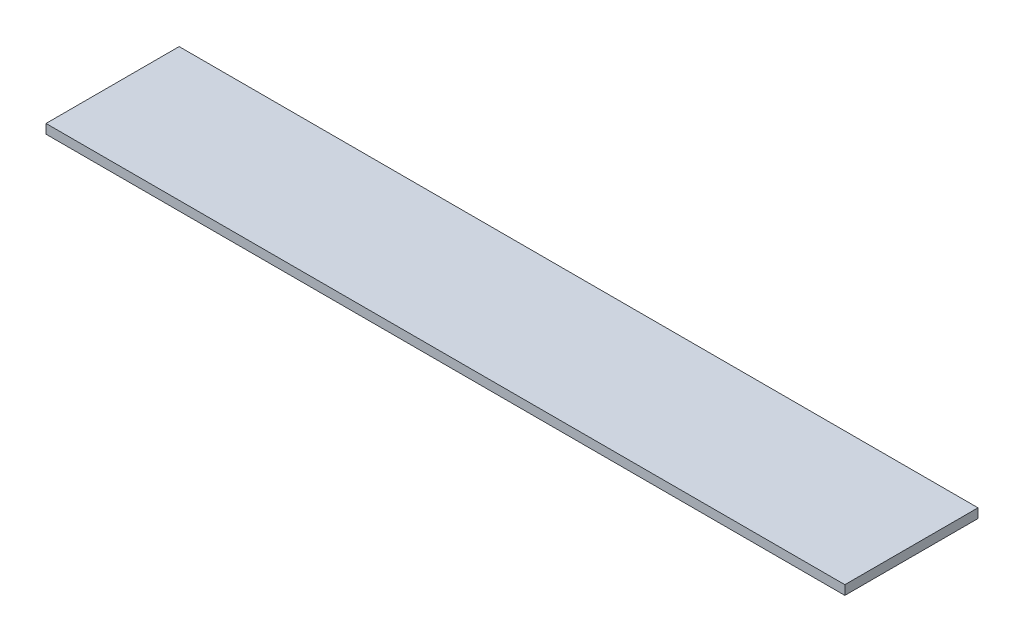
ISO-10303-21;
HEADER;
FILE_DESCRIPTION(('STEP AP214'),'2;1');
FILE_NAME('part.step','',(''),(''),'','','');
FILE_SCHEMA(('AUTOMOTIVE_DESIGN { 1 0 10303 214 1 1 1 1 }'));
ENDSEC;
DATA;
#1=APPLICATION_CONTEXT('core data for automotive mechanical design processes');
#2=APPLICATION_PROTOCOL_DEFINITION('international standard','automotive_design',2000,#1);
#3=PRODUCT_CONTEXT('',#1,'mechanical');
#4=PRODUCT('Part','Part','',(#3));
#5=PRODUCT_RELATED_PRODUCT_CATEGORY('part','',(#4));
#6=PRODUCT_DEFINITION_FORMATION('','',#4);
#7=PRODUCT_DEFINITION_CONTEXT('part definition',#1,'design');
#8=PRODUCT_DEFINITION('design','',#6,#7);
#9=PRODUCT_DEFINITION_SHAPE('','',#8);
#10=(LENGTH_UNIT() NAMED_UNIT(*) SI_UNIT(.MILLI.,.METRE.));
#11=(NAMED_UNIT(*) PLANE_ANGLE_UNIT() SI_UNIT($,.RADIAN.));
#12=(NAMED_UNIT(*) SI_UNIT($,.STERADIAN.) SOLID_ANGLE_UNIT());
#13=UNCERTAINTY_MEASURE_WITH_UNIT(LENGTH_MEASURE(1.E-05),#10,'distance_accuracy_value','');
#14=(GEOMETRIC_REPRESENTATION_CONTEXT(3) GLOBAL_UNCERTAINTY_ASSIGNED_CONTEXT((#13)) GLOBAL_UNIT_ASSIGNED_CONTEXT((#10,
#11,#12)) REPRESENTATION_CONTEXT('',''));
#15=CARTESIAN_POINT('',(0.,0.,0.));
#16=DIRECTION('',(0.,0.,1.));
#17=DIRECTION('',(1.,0.,0.));
#18=AXIS2_PLACEMENT_3D('',#15,#16,#17);
#19=CARTESIAN_POINT('',(30.,0.7,5.));
#20=DIRECTION('',(-1.,0.,0.));
#21=DIRECTION('',(0.,0.,1.));
#22=AXIS2_PLACEMENT_3D('',#19,#20,#21);
#23=PLANE('',#22);
#24=DIRECTION('',(0.,0.,-1.));
#25=VECTOR('',#24,1.);
#26=CARTESIAN_POINT('',(30.,0.,5.));
#27=LINE('',#26,#25);
#28=CARTESIAN_POINT('',(30.,0.,5.));
#29=VERTEX_POINT('',#28);
#30=CARTESIAN_POINT('',(30.,0.,-5.));
#31=VERTEX_POINT('',#30);
#32=EDGE_CURVE('E96',#29,#31,#27,.T.);
#33=ORIENTED_EDGE('',*,*,#32,.T.);
#34=DIRECTION('',(0.,-1.,0.));
#35=VECTOR('',#34,1.);
#36=CARTESIAN_POINT('',(30.,0.7,-5.));
#37=LINE('',#36,#35);
#38=CARTESIAN_POINT('',(30.,0.7,-5.));
#39=VERTEX_POINT('',#38);
#40=EDGE_CURVE('E11',#39,#31,#37,.T.);
#41=ORIENTED_EDGE('',*,*,#40,.F.);
#42=DIRECTION('',(0.,0.,-1.));
#43=VECTOR('',#42,1.);
#44=CARTESIAN_POINT('',(30.,0.7,5.));
#45=LINE('',#44,#43);
#46=CARTESIAN_POINT('',(30.,0.7,5.));
#47=VERTEX_POINT('',#46);
#48=EDGE_CURVE('E84',#47,#39,#45,.T.);
#49=ORIENTED_EDGE('',*,*,#48,.F.);
#50=DIRECTION('',(0.,-1.,0.));
#51=VECTOR('',#50,1.);
#52=CARTESIAN_POINT('',(30.,0.7,5.));
#53=LINE('',#52,#51);
#54=EDGE_CURVE('E92',#47,#29,#53,.T.);
#55=ORIENTED_EDGE('',*,*,#54,.T.);
#56=EDGE_LOOP('',(#33,#41,#49,#55));
#57=FACE_BOUND('',#56,.T.);
#58=ADVANCED_FACE('F33',(#57),#23,.F.);
#59=CARTESIAN_POINT('',(-30.,0.7,-5.));
#60=DIRECTION('',(0.,0.,1.));
#61=DIRECTION('',(1.,0.,0.));
#62=AXIS2_PLACEMENT_3D('',#59,#60,#61);
#63=PLANE('',#62);
#64=DIRECTION('',(-1.,0.,0.));
#65=VECTOR('',#64,1.);
#66=CARTESIAN_POINT('',(-30.,0.,-5.));
#67=LINE('',#66,#65);
#68=CARTESIAN_POINT('',(-30.,0.,-5.));
#69=VERTEX_POINT('',#68);
#70=EDGE_CURVE('E88',#31,#69,#67,.T.);
#71=ORIENTED_EDGE('',*,*,#70,.T.);
#72=DIRECTION('',(0.,-1.,0.));
#73=VECTOR('',#72,1.);
#74=CARTESIAN_POINT('',(-30.,0.7,-5.));
#75=LINE('',#74,#73);
#76=CARTESIAN_POINT('',(-30.,0.7,-5.));
#77=VERTEX_POINT('',#76);
#78=EDGE_CURVE('E41',#77,#69,#75,.T.);
#79=ORIENTED_EDGE('',*,*,#78,.F.);
#80=DIRECTION('',(-1.,0.,0.));
#81=VECTOR('',#80,1.);
#82=CARTESIAN_POINT('',(-30.,0.7,-5.));
#83=LINE('',#82,#81);
#84=EDGE_CURVE('E79',#39,#77,#83,.T.);
#85=ORIENTED_EDGE('',*,*,#84,.F.);
#86=ORIENTED_EDGE('',*,*,#40,.T.);
#87=EDGE_LOOP('',(#71,#79,#85,#86));
#88=FACE_BOUND('',#87,.T.);
#89=ADVANCED_FACE('F87',(#88),#63,.F.);
#90=CARTESIAN_POINT('',(-30.,0.7,5.));
#91=DIRECTION('',(1.,0.,0.));
#92=DIRECTION('',(0.,0.,-1.));
#93=AXIS2_PLACEMENT_3D('',#90,#91,#92);
#94=PLANE('',#93);
#95=DIRECTION('',(0.,0.,1.));
#96=VECTOR('',#95,1.);
#97=CARTESIAN_POINT('',(-30.,0.,5.));
#98=LINE('',#97,#96);
#99=CARTESIAN_POINT('',(-30.,0.,5.));
#100=VERTEX_POINT('',#99);
#101=EDGE_CURVE('E66',#69,#100,#98,.T.);
#102=ORIENTED_EDGE('',*,*,#101,.T.);
#103=DIRECTION('',(0.,-1.,0.));
#104=VECTOR('',#103,1.);
#105=CARTESIAN_POINT('',(-30.,0.7,5.));
#106=LINE('',#105,#104);
#107=CARTESIAN_POINT('',(-30.,0.7,5.));
#108=VERTEX_POINT('',#107);
#109=EDGE_CURVE('E89',#108,#100,#106,.T.);
#110=ORIENTED_EDGE('',*,*,#109,.F.);
#111=DIRECTION('',(0.,0.,1.));
#112=VECTOR('',#111,1.);
#113=CARTESIAN_POINT('',(-30.,0.7,5.));
#114=LINE('',#113,#112);
#115=EDGE_CURVE('E82',#77,#108,#114,.T.);
#116=ORIENTED_EDGE('',*,*,#115,.F.);
#117=ORIENTED_EDGE('',*,*,#78,.T.);
#118=EDGE_LOOP('',(#102,#110,#116,#117));
#119=FACE_BOUND('',#118,.T.);
#120=ADVANCED_FACE('F90',(#119),#94,.F.);
#121=CARTESIAN_POINT('',(-30.,0.7,5.));
#122=DIRECTION('',(0.,0.,-1.));
#123=DIRECTION('',(-1.,0.,0.));
#124=AXIS2_PLACEMENT_3D('',#121,#122,#123);
#125=PLANE('',#124);
#126=DIRECTION('',(1.,0.,0.));
#127=VECTOR('',#126,1.);
#128=CARTESIAN_POINT('',(-30.,0.,5.));
#129=LINE('',#128,#127);
#130=EDGE_CURVE('E72',#100,#29,#129,.T.);
#131=ORIENTED_EDGE('',*,*,#130,.T.);
#132=ORIENTED_EDGE('',*,*,#54,.F.);
#133=DIRECTION('',(1.,0.,0.));
#134=VECTOR('',#133,1.);
#135=CARTESIAN_POINT('',(-30.,0.7,5.));
#136=LINE('',#135,#134);
#137=EDGE_CURVE('E49',#108,#47,#136,.T.);
#138=ORIENTED_EDGE('',*,*,#137,.F.);
#139=ORIENTED_EDGE('',*,*,#109,.T.);
#140=EDGE_LOOP('',(#131,#132,#138,#139));
#141=FACE_BOUND('',#140,.T.);
#142=ADVANCED_FACE('F103',(#141),#125,.F.);
#143=CARTESIAN_POINT('',(0.,0.7,0.));
#144=DIRECTION('',(0.,-1.,0.));
#145=DIRECTION('',(0.,0.,-1.));
#146=AXIS2_PLACEMENT_3D('',#143,#144,#145);
#147=PLANE('',#146);
#148=ORIENTED_EDGE('',*,*,#48,.T.);
#149=ORIENTED_EDGE('',*,*,#84,.T.);
#150=ORIENTED_EDGE('',*,*,#115,.T.);
#151=ORIENTED_EDGE('',*,*,#137,.T.);
#152=EDGE_LOOP('',(#148,#149,#150,#151));
#153=FACE_BOUND('',#152,.T.);
#154=ADVANCED_FACE('F80',(#153),#147,.F.);
#155=CARTESIAN_POINT('',(0.,0.,0.));
#156=DIRECTION('',(0.,-1.,0.));
#157=DIRECTION('',(0.,0.,-1.));
#158=AXIS2_PLACEMENT_3D('',#155,#156,#157);
#159=PLANE('',#158);
#160=ORIENTED_EDGE('',*,*,#32,.F.);
#161=ORIENTED_EDGE('',*,*,#130,.F.);
#162=ORIENTED_EDGE('',*,*,#101,.F.);
#163=ORIENTED_EDGE('',*,*,#70,.F.);
#164=EDGE_LOOP('',(#160,#161,#162,#163));
#165=FACE_BOUND('',#164,.T.);
#166=ADVANCED_FACE('F106',(#165),#159,.T.);
#167=CLOSED_SHELL('',(#58,#89,#120,#142,#154,#166));
#168=MANIFOLD_SOLID_BREP('B2',#167);
#169=ADVANCED_BREP_SHAPE_REPRESENTATION('',(#18,#168),#14);
#170=SHAPE_DEFINITION_REPRESENTATION(#9,#169);
ENDSEC;
END-ISO-10303-21;
